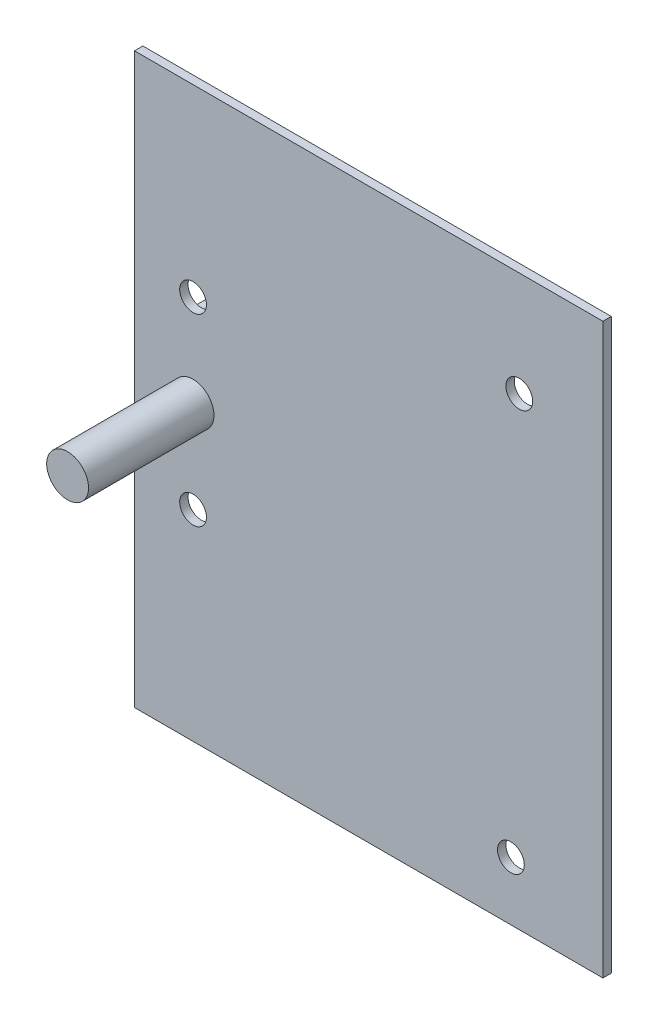
ISO-10303-21;
HEADER;
FILE_DESCRIPTION(('STEP AP214'),'2;1');
FILE_NAME('part.step','',(''),(''),'','','');
FILE_SCHEMA(('AUTOMOTIVE_DESIGN { 1 0 10303 214 1 1 1 1 }'));
ENDSEC;
DATA;
#1=APPLICATION_CONTEXT('core data for automotive mechanical design processes');
#2=APPLICATION_PROTOCOL_DEFINITION('international standard','automotive_design',2000,#1);
#3=PRODUCT_CONTEXT('',#1,'mechanical');
#4=PRODUCT('Part','Part','',(#3));
#5=PRODUCT_RELATED_PRODUCT_CATEGORY('part','',(#4));
#6=PRODUCT_DEFINITION_FORMATION('','',#4);
#7=PRODUCT_DEFINITION_CONTEXT('part definition',#1,'design');
#8=PRODUCT_DEFINITION('design','',#6,#7);
#9=PRODUCT_DEFINITION_SHAPE('','',#8);
#10=(LENGTH_UNIT() NAMED_UNIT(*) SI_UNIT(.MILLI.,.METRE.));
#11=(NAMED_UNIT(*) PLANE_ANGLE_UNIT() SI_UNIT($,.RADIAN.));
#12=(NAMED_UNIT(*) SI_UNIT($,.STERADIAN.) SOLID_ANGLE_UNIT());
#13=UNCERTAINTY_MEASURE_WITH_UNIT(LENGTH_MEASURE(1.E-05),#10,'distance_accuracy_value','');
#14=(GEOMETRIC_REPRESENTATION_CONTEXT(3) GLOBAL_UNCERTAINTY_ASSIGNED_CONTEXT((#13)) GLOBAL_UNIT_ASSIGNED_CONTEXT((#10,
#11,#12)) REPRESENTATION_CONTEXT('',''));
#15=CARTESIAN_POINT('',(0.,0.,0.));
#16=DIRECTION('',(0.,0.,1.));
#17=DIRECTION('',(1.,0.,0.));
#18=AXIS2_PLACEMENT_3D('',#15,#16,#17);
#19=CARTESIAN_POINT('',(-23.,-28.,-0.5));
#20=DIRECTION('',(0.,0.,1.));
#21=DIRECTION('',(1.,0.,0.));
#22=AXIS2_PLACEMENT_3D('',#19,#20,#21);
#23=PLANE('',#22);
#24=CARTESIAN_POINT('',(22.,-21.,-0.5));
#25=DIRECTION('',(0.,0.,1.));
#26=DIRECTION('',(1.,0.,0.));
#27=AXIS2_PLACEMENT_3D('',#24,#25,#26);
#28=CIRCLE('',#27,1.6);
#29=CARTESIAN_POINT('',(23.6,-21.,-0.5));
#30=VERTEX_POINT('',#29);
#31=EDGE_CURVE('E245',#30,#30,#28,.T.);
#32=ORIENTED_EDGE('',*,*,#31,.T.);
#33=EDGE_LOOP('',(#32));
#34=FACE_BOUND('',#33,.T.);
#35=CARTESIAN_POINT('',(23.,27.5,-0.5));
#36=DIRECTION('',(0.,0.,1.));
#37=DIRECTION('',(1.,0.,0.));
#38=AXIS2_PLACEMENT_3D('',#35,#36,#37);
#39=CIRCLE('',#38,1.6);
#40=CARTESIAN_POINT('',(24.6,27.5,-0.5));
#41=VERTEX_POINT('',#40);
#42=EDGE_CURVE('E249',#41,#41,#39,.T.);
#43=ORIENTED_EDGE('',*,*,#42,.T.);
#44=EDGE_LOOP('',(#43));
#45=FACE_BOUND('',#44,.T.);
#46=CARTESIAN_POINT('',(-16.,18.,-0.5));
#47=DIRECTION('',(0.,0.,1.));
#48=DIRECTION('',(1.,0.,0.));
#49=AXIS2_PLACEMENT_3D('',#46,#47,#48);
#50=CIRCLE('',#49,1.6);
#51=CARTESIAN_POINT('',(-14.4,18.,-0.5));
#52=VERTEX_POINT('',#51);
#53=EDGE_CURVE('E258',#52,#52,#50,.T.);
#54=ORIENTED_EDGE('',*,*,#53,.T.);
#55=EDGE_LOOP('',(#54));
#56=FACE_BOUND('',#55,.T.);
#57=CARTESIAN_POINT('',(-16.,-4.,-0.5));
#58=DIRECTION('',(0.,0.,-1.));
#59=DIRECTION('',(-1.,0.,0.));
#60=AXIS2_PLACEMENT_3D('',#57,#58,#59);
#61=CIRCLE('',#60,1.6);
#62=CARTESIAN_POINT('',(-17.6,-4.,-0.5));
#63=VERTEX_POINT('',#62);
#64=EDGE_CURVE('E261',#63,#63,#61,.T.);
#65=ORIENTED_EDGE('',*,*,#64,.F.);
#66=EDGE_LOOP('',(#65));
#67=FACE_BOUND('',#66,.T.);
#68=DIRECTION('',(0.,-1.,0.));
#69=VECTOR('',#68,1.);
#70=CARTESIAN_POINT('',(-23.,40.,-0.5));
#71=LINE('',#70,#69);
#72=CARTESIAN_POINT('',(-23.,40.,-0.5));
#73=VERTEX_POINT('',#72);
#74=CARTESIAN_POINT('',(-23.,-28.,-0.5));
#75=VERTEX_POINT('',#74);
#76=EDGE_CURVE('E128',#73,#75,#71,.T.);
#77=ORIENTED_EDGE('',*,*,#76,.F.);
#78=DIRECTION('',(-1.,0.,0.));
#79=VECTOR('',#78,1.);
#80=CARTESIAN_POINT('',(-23.,40.,-0.5));
#81=LINE('',#80,#79);
#82=CARTESIAN_POINT('',(33.,40.,-0.5));
#83=VERTEX_POINT('',#82);
#84=EDGE_CURVE('E134',#83,#73,#81,.T.);
#85=ORIENTED_EDGE('',*,*,#84,.F.);
#86=DIRECTION('',(0.,1.,0.));
#87=VECTOR('',#86,1.);
#88=CARTESIAN_POINT('',(33.,40.,-0.5));
#89=LINE('',#88,#87);
#90=CARTESIAN_POINT('',(33.,-28.,-0.5));
#91=VERTEX_POINT('',#90);
#92=EDGE_CURVE('E145',#91,#83,#89,.T.);
#93=ORIENTED_EDGE('',*,*,#92,.F.);
#94=DIRECTION('',(1.,0.,0.));
#95=VECTOR('',#94,1.);
#96=CARTESIAN_POINT('',(-23.,-28.,-0.5));
#97=LINE('',#96,#95);
#98=EDGE_CURVE('E143',#75,#91,#97,.T.);
#99=ORIENTED_EDGE('',*,*,#98,.F.);
#100=EDGE_LOOP('',(#77,#85,#93,#99));
#101=FACE_BOUND('',#100,.T.);
#102=DIRECTION('',(0.,-1.,0.));
#103=VECTOR('',#102,1.);
#104=CARTESIAN_POINT('',(-15.,12.,-0.5));
#105=LINE('',#104,#103);
#106=CARTESIAN_POINT('',(-15.,12.,-0.5));
#107=VERTEX_POINT('',#106);
#108=CARTESIAN_POINT('',(-15.,1.99999999999999,-0.5));
#109=VERTEX_POINT('',#108);
#110=EDGE_CURVE('E117',#107,#109,#105,.T.);
#111=ORIENTED_EDGE('',*,*,#110,.F.);
#112=DIRECTION('',(1.,0.,0.));
#113=VECTOR('',#112,1.);
#114=CARTESIAN_POINT('',(-15.,12.,-0.5));
#115=LINE('',#114,#113);
#116=CARTESIAN_POINT('',(-21.,12.,-0.5));
#117=VERTEX_POINT('',#116);
#118=EDGE_CURVE('E114',#117,#107,#115,.T.);
#119=ORIENTED_EDGE('',*,*,#118,.F.);
#120=DIRECTION('',(0.,1.,0.));
#121=VECTOR('',#120,1.);
#122=CARTESIAN_POINT('',(-21.,12.,-0.5));
#123=LINE('',#122,#121);
#124=CARTESIAN_POINT('',(-21.,1.99999999999999,-0.5));
#125=VERTEX_POINT('',#124);
#126=EDGE_CURVE('E52',#125,#117,#123,.T.);
#127=ORIENTED_EDGE('',*,*,#126,.F.);
#128=DIRECTION('',(-1.,0.,0.));
#129=VECTOR('',#128,1.);
#130=CARTESIAN_POINT('',(-15.,1.99999999999999,-0.5));
#131=LINE('',#130,#129);
#132=EDGE_CURVE('E47',#109,#125,#131,.T.);
#133=ORIENTED_EDGE('',*,*,#132,.F.);
#134=EDGE_LOOP('',(#111,#119,#127,#133));
#135=FACE_BOUND('',#134,.T.);
#136=ADVANCED_FACE('F31',(#34,#45,#56,#67,#101,#135),#23,.F.);
#137=CARTESIAN_POINT('',(-23.,-28.,0.5));
#138=DIRECTION('',(0.,0.,1.));
#139=DIRECTION('',(1.,0.,0.));
#140=AXIS2_PLACEMENT_3D('',#137,#138,#139);
#141=PLANE('',#140);
#142=CARTESIAN_POINT('',(22.,-21.,0.5));
#143=DIRECTION('',(0.,0.,1.));
#144=DIRECTION('',(1.,0.,0.));
#145=AXIS2_PLACEMENT_3D('',#142,#143,#144);
#146=CIRCLE('',#145,1.6);
#147=CARTESIAN_POINT('',(23.6,-21.,0.5));
#148=VERTEX_POINT('',#147);
#149=EDGE_CURVE('E243',#148,#148,#146,.T.);
#150=ORIENTED_EDGE('',*,*,#149,.F.);
#151=EDGE_LOOP('',(#150));
#152=FACE_BOUND('',#151,.T.);
#153=CARTESIAN_POINT('',(23.,27.5,0.5));
#154=DIRECTION('',(0.,0.,1.));
#155=DIRECTION('',(1.,0.,0.));
#156=AXIS2_PLACEMENT_3D('',#153,#154,#155);
#157=CIRCLE('',#156,1.6);
#158=CARTESIAN_POINT('',(24.6,27.5,0.5));
#159=VERTEX_POINT('',#158);
#160=EDGE_CURVE('E246',#159,#159,#157,.T.);
#161=ORIENTED_EDGE('',*,*,#160,.F.);
#162=EDGE_LOOP('',(#161));
#163=FACE_BOUND('',#162,.T.);
#164=CARTESIAN_POINT('',(-16.,18.,0.5));
#165=DIRECTION('',(0.,0.,1.));
#166=DIRECTION('',(1.,0.,0.));
#167=AXIS2_PLACEMENT_3D('',#164,#165,#166);
#168=CIRCLE('',#167,1.6);
#169=CARTESIAN_POINT('',(-14.4,18.,0.5));
#170=VERTEX_POINT('',#169);
#171=EDGE_CURVE('E255',#170,#170,#168,.T.);
#172=ORIENTED_EDGE('',*,*,#171,.F.);
#173=EDGE_LOOP('',(#172));
#174=FACE_BOUND('',#173,.T.);
#175=CARTESIAN_POINT('',(-16.,-4.,0.5));
#176=DIRECTION('',(0.,0.,1.));
#177=DIRECTION('',(1.,0.,0.));
#178=AXIS2_PLACEMENT_3D('',#175,#176,#177);
#179=CIRCLE('',#178,1.6);
#180=CARTESIAN_POINT('',(-14.4,-4.,0.5));
#181=VERTEX_POINT('',#180);
#182=EDGE_CURVE('E35',#181,#181,#179,.T.);
#183=ORIENTED_EDGE('',*,*,#182,.F.);
#184=EDGE_LOOP('',(#183));
#185=FACE_BOUND('',#184,.T.);
#186=DIRECTION('',(0.,-1.,0.));
#187=VECTOR('',#186,1.);
#188=CARTESIAN_POINT('',(-23.,40.,0.5));
#189=LINE('',#188,#187);
#190=CARTESIAN_POINT('',(-23.,40.,0.5));
#191=VERTEX_POINT('',#190);
#192=CARTESIAN_POINT('',(-23.,-28.,0.5));
#193=VERTEX_POINT('',#192);
#194=EDGE_CURVE('E130',#191,#193,#189,.T.);
#195=ORIENTED_EDGE('',*,*,#194,.T.);
#196=DIRECTION('',(1.,0.,0.));
#197=VECTOR('',#196,1.);
#198=CARTESIAN_POINT('',(-23.,-28.,0.5));
#199=LINE('',#198,#197);
#200=CARTESIAN_POINT('',(33.,-28.,0.5));
#201=VERTEX_POINT('',#200);
#202=EDGE_CURVE('E133',#193,#201,#199,.T.);
#203=ORIENTED_EDGE('',*,*,#202,.T.);
#204=DIRECTION('',(0.,1.,0.));
#205=VECTOR('',#204,1.);
#206=CARTESIAN_POINT('',(33.,40.,0.5));
#207=LINE('',#206,#205);
#208=CARTESIAN_POINT('',(33.,40.,0.5));
#209=VERTEX_POINT('',#208);
#210=EDGE_CURVE('E136',#201,#209,#207,.T.);
#211=ORIENTED_EDGE('',*,*,#210,.T.);
#212=DIRECTION('',(-1.,0.,0.));
#213=VECTOR('',#212,1.);
#214=CARTESIAN_POINT('',(-23.,40.,0.5));
#215=LINE('',#214,#213);
#216=EDGE_CURVE('E138',#209,#191,#215,.T.);
#217=ORIENTED_EDGE('',*,*,#216,.T.);
#218=EDGE_LOOP('',(#195,#203,#211,#217));
#219=FACE_BOUND('',#218,.T.);
#220=CARTESIAN_POINT('',(-16.,7.,0.5));
#221=DIRECTION('',(0.,0.,1.));
#222=DIRECTION('',(1.,0.,0.));
#223=AXIS2_PLACEMENT_3D('',#220,#221,#222);
#224=CIRCLE('',#223,2.5);
#225=CARTESIAN_POINT('',(-13.5,7.,0.5));
#226=VERTEX_POINT('',#225);
#227=EDGE_CURVE('E118',#226,#226,#224,.T.);
#228=ORIENTED_EDGE('',*,*,#227,.F.);
#229=EDGE_LOOP('',(#228));
#230=FACE_BOUND('',#229,.T.);
#231=ADVANCED_FACE('F172',(#152,#163,#174,#185,#219,#230),#141,.T.);
#232=CARTESIAN_POINT('',(-23.,40.,0.5));
#233=DIRECTION('',(1.,0.,0.));
#234=DIRECTION('',(0.,1.,0.));
#235=AXIS2_PLACEMENT_3D('',#232,#233,#234);
#236=PLANE('',#235);
#237=ORIENTED_EDGE('',*,*,#76,.T.);
#238=DIRECTION('',(0.,0.,-1.));
#239=VECTOR('',#238,1.);
#240=CARTESIAN_POINT('',(-23.,-28.,0.5));
#241=LINE('',#240,#239);
#242=EDGE_CURVE('E11',#193,#75,#241,.T.);
#243=ORIENTED_EDGE('',*,*,#242,.F.);
#244=ORIENTED_EDGE('',*,*,#194,.F.);
#245=DIRECTION('',(0.,0.,-1.));
#246=VECTOR('',#245,1.);
#247=CARTESIAN_POINT('',(-23.,40.,0.5));
#248=LINE('',#247,#246);
#249=EDGE_CURVE('E140',#191,#73,#248,.T.);
#250=ORIENTED_EDGE('',*,*,#249,.T.);
#251=EDGE_LOOP('',(#237,#243,#244,#250));
#252=FACE_BOUND('',#251,.T.);
#253=ADVANCED_FACE('F33',(#252),#236,.F.);
#254=CARTESIAN_POINT('',(-23.,-28.,0.5));
#255=DIRECTION('',(0.,1.,0.));
#256=DIRECTION('',(0.,0.,1.));
#257=AXIS2_PLACEMENT_3D('',#254,#255,#256);
#258=PLANE('',#257);
#259=ORIENTED_EDGE('',*,*,#98,.T.);
#260=DIRECTION('',(0.,0.,-1.));
#261=VECTOR('',#260,1.);
#262=CARTESIAN_POINT('',(33.,-28.,0.5));
#263=LINE('',#262,#261);
#264=EDGE_CURVE('E40',#201,#91,#263,.T.);
#265=ORIENTED_EDGE('',*,*,#264,.F.);
#266=ORIENTED_EDGE('',*,*,#202,.F.);
#267=ORIENTED_EDGE('',*,*,#242,.T.);
#268=EDGE_LOOP('',(#259,#265,#266,#267));
#269=FACE_BOUND('',#268,.T.);
#270=ADVANCED_FACE('F174',(#269),#258,.F.);
#271=CARTESIAN_POINT('',(33.,40.,0.5));
#272=DIRECTION('',(-1.,0.,0.));
#273=DIRECTION('',(0.,-1.,0.));
#274=AXIS2_PLACEMENT_3D('',#271,#272,#273);
#275=PLANE('',#274);
#276=ORIENTED_EDGE('',*,*,#92,.T.);
#277=DIRECTION('',(0.,0.,-1.));
#278=VECTOR('',#277,1.);
#279=CARTESIAN_POINT('',(33.,40.,0.5));
#280=LINE('',#279,#278);
#281=EDGE_CURVE('E150',#209,#83,#280,.T.);
#282=ORIENTED_EDGE('',*,*,#281,.F.);
#283=ORIENTED_EDGE('',*,*,#210,.F.);
#284=ORIENTED_EDGE('',*,*,#264,.T.);
#285=EDGE_LOOP('',(#276,#282,#283,#284));
#286=FACE_BOUND('',#285,.T.);
#287=ADVANCED_FACE('F158',(#286),#275,.F.);
#288=CARTESIAN_POINT('',(-23.,40.,0.5));
#289=DIRECTION('',(0.,-1.,0.));
#290=DIRECTION('',(1.,0.,0.));
#291=AXIS2_PLACEMENT_3D('',#288,#289,#290);
#292=PLANE('',#291);
#293=ORIENTED_EDGE('',*,*,#84,.T.);
#294=ORIENTED_EDGE('',*,*,#249,.F.);
#295=ORIENTED_EDGE('',*,*,#216,.F.);
#296=ORIENTED_EDGE('',*,*,#281,.T.);
#297=EDGE_LOOP('',(#293,#294,#295,#296));
#298=FACE_BOUND('',#297,.T.);
#299=ADVANCED_FACE('F166',(#298),#292,.F.);
#300=CARTESIAN_POINT('',(-16.,7.,15.5));
#301=DIRECTION('',(0.,0.,-1.));
#302=DIRECTION('',(-1.,0.,0.));
#303=AXIS2_PLACEMENT_3D('',#300,#301,#302);
#304=CYLINDRICAL_SURFACE('',#303,2.5);
#305=CARTESIAN_POINT('',(-16.,7.,15.5));
#306=DIRECTION('',(0.,0.,1.));
#307=DIRECTION('',(1.,0.,0.));
#308=AXIS2_PLACEMENT_3D('',#305,#306,#307);
#309=CIRCLE('',#308,2.5);
#310=CARTESIAN_POINT('',(-13.5,7.,15.5));
#311=VERTEX_POINT('',#310);
#312=EDGE_CURVE('E121',#311,#311,#309,.T.);
#313=ORIENTED_EDGE('',*,*,#312,.F.);
#314=EDGE_LOOP('',(#313));
#315=FACE_BOUND('',#314,.T.);
#316=ORIENTED_EDGE('',*,*,#227,.T.);
#317=EDGE_LOOP('',(#316));
#318=FACE_BOUND('',#317,.T.);
#319=ADVANCED_FACE('F195',(#315,#318),#304,.T.);
#320=CARTESIAN_POINT('',(-16.,7.,15.5));
#321=DIRECTION('',(0.,0.,1.));
#322=DIRECTION('',(1.,0.,0.));
#323=AXIS2_PLACEMENT_3D('',#320,#321,#322);
#324=PLANE('',#323);
#325=ORIENTED_EDGE('',*,*,#312,.T.);
#326=EDGE_LOOP('',(#325));
#327=FACE_BOUND('',#326,.T.);
#328=ADVANCED_FACE('F199',(#327),#324,.T.);
#329=CARTESIAN_POINT('',(-15.,12.,-10.5));
#330=DIRECTION('',(-1.,0.,0.));
#331=DIRECTION('',(0.,0.,1.));
#332=AXIS2_PLACEMENT_3D('',#329,#330,#331);
#333=PLANE('',#332);
#334=ORIENTED_EDGE('',*,*,#110,.T.);
#335=DIRECTION('',(0.,0.,1.));
#336=VECTOR('',#335,1.);
#337=CARTESIAN_POINT('',(-15.,1.99999999999999,-10.5));
#338=LINE('',#337,#336);
#339=CARTESIAN_POINT('',(-15.,1.99999999999999,-10.5));
#340=VERTEX_POINT('',#339);
#341=EDGE_CURVE('E98',#340,#109,#338,.T.);
#342=ORIENTED_EDGE('',*,*,#341,.F.);
#343=DIRECTION('',(0.,-1.,0.));
#344=VECTOR('',#343,1.);
#345=CARTESIAN_POINT('',(-15.,12.,-10.5));
#346=LINE('',#345,#344);
#347=CARTESIAN_POINT('',(-15.,12.,-10.5));
#348=VERTEX_POINT('',#347);
#349=EDGE_CURVE('E105',#348,#340,#346,.T.);
#350=ORIENTED_EDGE('',*,*,#349,.F.);
#351=DIRECTION('',(0.,0.,1.));
#352=VECTOR('',#351,1.);
#353=CARTESIAN_POINT('',(-15.,12.,-10.5));
#354=LINE('',#353,#352);
#355=EDGE_CURVE('E266',#348,#107,#354,.T.);
#356=ORIENTED_EDGE('',*,*,#355,.T.);
#357=EDGE_LOOP('',(#334,#342,#350,#356));
#358=FACE_BOUND('',#357,.T.);
#359=ADVANCED_FACE('F116',(#358),#333,.F.);
#360=CARTESIAN_POINT('',(-15.,1.99999999999999,-10.5));
#361=DIRECTION('',(0.,1.,0.));
#362=DIRECTION('',(0.,0.,1.));
#363=AXIS2_PLACEMENT_3D('',#360,#361,#362);
#364=PLANE('',#363);
#365=ORIENTED_EDGE('',*,*,#132,.T.);
#366=DIRECTION('',(0.,0.,1.));
#367=VECTOR('',#366,1.);
#368=CARTESIAN_POINT('',(-21.,1.99999999999999,-10.5));
#369=LINE('',#368,#367);
#370=CARTESIAN_POINT('',(-21.,1.99999999999999,-10.5));
#371=VERTEX_POINT('',#370);
#372=EDGE_CURVE('E101',#371,#125,#369,.T.);
#373=ORIENTED_EDGE('',*,*,#372,.F.);
#374=DIRECTION('',(-1.,0.,0.));
#375=VECTOR('',#374,1.);
#376=CARTESIAN_POINT('',(-15.,1.99999999999999,-10.5));
#377=LINE('',#376,#375);
#378=EDGE_CURVE('E94',#340,#371,#377,.T.);
#379=ORIENTED_EDGE('',*,*,#378,.F.);
#380=ORIENTED_EDGE('',*,*,#341,.T.);
#381=EDGE_LOOP('',(#365,#373,#379,#380));
#382=FACE_BOUND('',#381,.T.);
#383=ADVANCED_FACE('F96',(#382),#364,.F.);
#384=CARTESIAN_POINT('',(-21.,12.,-10.5));
#385=DIRECTION('',(1.,0.,0.));
#386=DIRECTION('',(0.,1.,0.));
#387=AXIS2_PLACEMENT_3D('',#384,#385,#386);
#388=PLANE('',#387);
#389=ORIENTED_EDGE('',*,*,#126,.T.);
#390=DIRECTION('',(0.,0.,1.));
#391=VECTOR('',#390,1.);
#392=CARTESIAN_POINT('',(-21.,12.,-10.5));
#393=LINE('',#392,#391);
#394=CARTESIAN_POINT('',(-21.,12.,-10.5));
#395=VERTEX_POINT('',#394);
#396=EDGE_CURVE('E123',#395,#117,#393,.T.);
#397=ORIENTED_EDGE('',*,*,#396,.F.);
#398=DIRECTION('',(0.,1.,0.));
#399=VECTOR('',#398,1.);
#400=CARTESIAN_POINT('',(-21.,12.,-10.5));
#401=LINE('',#400,#399);
#402=EDGE_CURVE('E104',#371,#395,#401,.T.);
#403=ORIENTED_EDGE('',*,*,#402,.F.);
#404=ORIENTED_EDGE('',*,*,#372,.T.);
#405=EDGE_LOOP('',(#389,#397,#403,#404));
#406=FACE_BOUND('',#405,.T.);
#407=ADVANCED_FACE('F213',(#406),#388,.F.);
#408=CARTESIAN_POINT('',(-15.,12.,-10.5));
#409=DIRECTION('',(0.,-1.,0.));
#410=DIRECTION('',(0.,0.,-1.));
#411=AXIS2_PLACEMENT_3D('',#408,#409,#410);
#412=PLANE('',#411);
#413=ORIENTED_EDGE('',*,*,#118,.T.);
#414=ORIENTED_EDGE('',*,*,#355,.F.);
#415=DIRECTION('',(1.,0.,0.));
#416=VECTOR('',#415,1.);
#417=CARTESIAN_POINT('',(-15.,12.,-10.5));
#418=LINE('',#417,#416);
#419=EDGE_CURVE('E110',#395,#348,#418,.T.);
#420=ORIENTED_EDGE('',*,*,#419,.F.);
#421=ORIENTED_EDGE('',*,*,#396,.T.);
#422=EDGE_LOOP('',(#413,#414,#420,#421));
#423=FACE_BOUND('',#422,.T.);
#424=ADVANCED_FACE('F216',(#423),#412,.F.);
#425=CARTESIAN_POINT('',(-15.,1.99999999999999,-10.5));
#426=DIRECTION('',(0.,0.,-1.));
#427=DIRECTION('',(-1.,0.,0.));
#428=AXIS2_PLACEMENT_3D('',#425,#426,#427);
#429=PLANE('',#428);
#430=ORIENTED_EDGE('',*,*,#349,.T.);
#431=ORIENTED_EDGE('',*,*,#378,.T.);
#432=ORIENTED_EDGE('',*,*,#402,.T.);
#433=ORIENTED_EDGE('',*,*,#419,.T.);
#434=EDGE_LOOP('',(#430,#431,#432,#433));
#435=FACE_BOUND('',#434,.T.);
#436=ADVANCED_FACE('F108',(#435),#429,.T.);
#437=CARTESIAN_POINT('',(-16.,-4.,9.5));
#438=DIRECTION('',(0.,0.,-1.));
#439=DIRECTION('',(-1.,0.,0.));
#440=AXIS2_PLACEMENT_3D('',#437,#438,#439);
#441=CYLINDRICAL_SURFACE('',#440,1.6);
#442=ORIENTED_EDGE('',*,*,#182,.T.);
#443=EDGE_LOOP('',(#442));
#444=FACE_BOUND('',#443,.T.);
#445=ORIENTED_EDGE('',*,*,#64,.T.);
#446=EDGE_LOOP('',(#445));
#447=FACE_BOUND('',#446,.T.);
#448=ADVANCED_FACE('F223',(#444,#447),#441,.F.);
#449=CARTESIAN_POINT('',(-16.,18.,-9.5));
#450=DIRECTION('',(0.,0.,1.));
#451=DIRECTION('',(1.,0.,0.));
#452=AXIS2_PLACEMENT_3D('',#449,#450,#451);
#453=CYLINDRICAL_SURFACE('',#452,1.6);
#454=ORIENTED_EDGE('',*,*,#171,.T.);
#455=EDGE_LOOP('',(#454));
#456=FACE_BOUND('',#455,.T.);
#457=ORIENTED_EDGE('',*,*,#53,.F.);
#458=EDGE_LOOP('',(#457));
#459=FACE_BOUND('',#458,.T.);
#460=ADVANCED_FACE('F226',(#456,#459),#453,.F.);
#461=CARTESIAN_POINT('',(23.,27.5,-9.5));
#462=DIRECTION('',(0.,0.,1.));
#463=DIRECTION('',(1.,0.,0.));
#464=AXIS2_PLACEMENT_3D('',#461,#462,#463);
#465=CYLINDRICAL_SURFACE('',#464,1.6);
#466=ORIENTED_EDGE('',*,*,#160,.T.);
#467=EDGE_LOOP('',(#466));
#468=FACE_BOUND('',#467,.T.);
#469=ORIENTED_EDGE('',*,*,#42,.F.);
#470=EDGE_LOOP('',(#469));
#471=FACE_BOUND('',#470,.T.);
#472=ADVANCED_FACE('F230',(#468,#471),#465,.F.);
#473=CARTESIAN_POINT('',(22.,-21.,-9.5));
#474=DIRECTION('',(0.,0.,1.));
#475=DIRECTION('',(1.,0.,0.));
#476=AXIS2_PLACEMENT_3D('',#473,#474,#475);
#477=CYLINDRICAL_SURFACE('',#476,1.6);
#478=ORIENTED_EDGE('',*,*,#149,.T.);
#479=EDGE_LOOP('',(#478));
#480=FACE_BOUND('',#479,.T.);
#481=ORIENTED_EDGE('',*,*,#31,.F.);
#482=EDGE_LOOP('',(#481));
#483=FACE_BOUND('',#482,.T.);
#484=ADVANCED_FACE('F234',(#480,#483),#477,.F.);
#485=CLOSED_SHELL('',(#136,#231,#253,#270,#287,#299,#319,#328,#359,#383,#407,#424,#436,#448,
#460,#472,#484));
#486=MANIFOLD_SOLID_BREP('B2',#485);
#487=ADVANCED_BREP_SHAPE_REPRESENTATION('',(#18,#486),#14);
#488=SHAPE_DEFINITION_REPRESENTATION(#9,#487);
ENDSEC;
END-ISO-10303-21;
